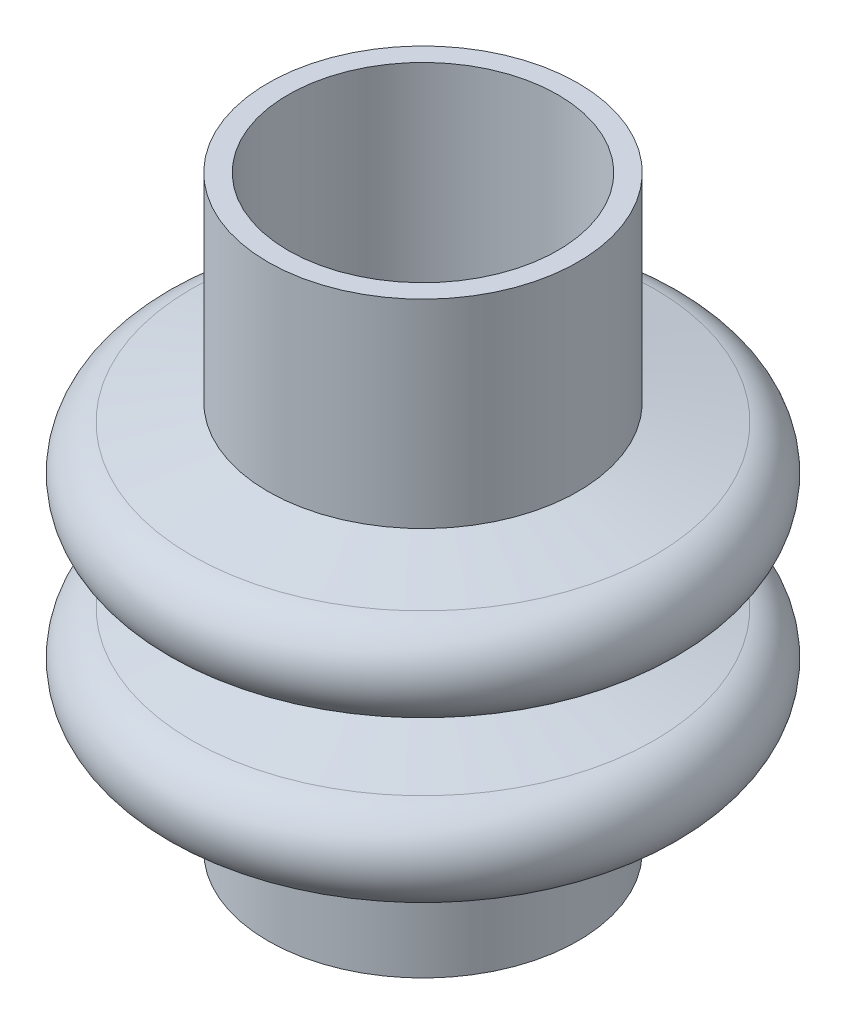
ISO-10303-21;
HEADER;
FILE_DESCRIPTION(('STEP AP214'),'2;1');
FILE_NAME('part.step','',(''),(''),'','','');
FILE_SCHEMA(('AUTOMOTIVE_DESIGN { 1 0 10303 214 1 1 1 1 }'));
ENDSEC;
DATA;
#1=APPLICATION_CONTEXT('core data for automotive mechanical design processes');
#2=APPLICATION_PROTOCOL_DEFINITION('international standard','automotive_design',2000,#1);
#3=PRODUCT_CONTEXT('',#1,'mechanical');
#4=PRODUCT('Part','Part','',(#3));
#5=PRODUCT_RELATED_PRODUCT_CATEGORY('part','',(#4));
#6=PRODUCT_DEFINITION_FORMATION('','',#4);
#7=PRODUCT_DEFINITION_CONTEXT('part definition',#1,'design');
#8=PRODUCT_DEFINITION('design','',#6,#7);
#9=PRODUCT_DEFINITION_SHAPE('','',#8);
#10=(LENGTH_UNIT() NAMED_UNIT(*) SI_UNIT(.MILLI.,.METRE.));
#11=(NAMED_UNIT(*) PLANE_ANGLE_UNIT() SI_UNIT($,.RADIAN.));
#12=(NAMED_UNIT(*) SI_UNIT($,.STERADIAN.) SOLID_ANGLE_UNIT());
#13=UNCERTAINTY_MEASURE_WITH_UNIT(LENGTH_MEASURE(1.E-05),#10,'distance_accuracy_value','');
#14=(GEOMETRIC_REPRESENTATION_CONTEXT(3) GLOBAL_UNCERTAINTY_ASSIGNED_CONTEXT((#13)) GLOBAL_UNIT_ASSIGNED_CONTEXT((#10,
#11,#12)) REPRESENTATION_CONTEXT('',''));
#15=CARTESIAN_POINT('',(0.,0.,0.));
#16=DIRECTION('',(0.,0.,1.));
#17=DIRECTION('',(1.,0.,0.));
#18=AXIS2_PLACEMENT_3D('',#15,#16,#17);
#19=CARTESIAN_POINT('',(-5.35570430156325,-15.3384460628714,0.));
#20=DIRECTION('',(0.,1.,0.));
#21=DIRECTION('',(0.,0.,1.));
#22=AXIS2_PLACEMENT_3D('',#19,#20,#21);
#23=PLANE('',#22);
#24=CARTESIAN_POINT('',(-5.35570430156325,-15.3384460628714,0.));
#25=DIRECTION('',(0.,-1.,0.));
#26=DIRECTION('',(0.,0.,-1.));
#27=AXIS2_PLACEMENT_3D('',#24,#25,#26);
#28=CIRCLE('',#27,5.35570430156325);
#29=CARTESIAN_POINT('',(-5.35570430156325,-15.3384460628714,-5.35570430156325));
#30=VERTEX_POINT('',#29);
#31=EDGE_CURVE('E78',#30,#30,#28,.T.);
#32=ORIENTED_EDGE('',*,*,#31,.F.);
#33=EDGE_LOOP('',(#32));
#34=FACE_BOUND('',#33,.T.);
#35=CARTESIAN_POINT('',(-5.35570430156325,-15.3384460628714,0.));
#36=DIRECTION('',(0.,-1.,0.));
#37=DIRECTION('',(0.,0.,-1.));
#38=AXIS2_PLACEMENT_3D('',#35,#36,#37);
#39=CIRCLE('',#38,6.15570430156325);
#40=CARTESIAN_POINT('',(-5.35570430156325,-15.3384460628714,-6.15570430156325));
#41=VERTEX_POINT('',#40);
#42=EDGE_CURVE('E36',#41,#41,#39,.T.);
#43=ORIENTED_EDGE('',*,*,#42,.T.);
#44=EDGE_LOOP('',(#43));
#45=FACE_BOUND('',#44,.T.);
#46=ADVANCED_FACE('F33',(#34,#45),#23,.F.);
#47=CARTESIAN_POINT('',(-5.35570430156325,8.,0.));
#48=DIRECTION('',(0.,1.,0.));
#49=DIRECTION('',(0.,0.,1.));
#50=AXIS2_PLACEMENT_3D('',#47,#48,#49);
#51=PLANE('',#50);
#52=CARTESIAN_POINT('',(-5.35570430156325,8.,0.));
#53=DIRECTION('',(0.,-1.,0.));
#54=DIRECTION('',(0.,0.,-1.));
#55=AXIS2_PLACEMENT_3D('',#52,#53,#54);
#56=CIRCLE('',#55,5.35570430156325);
#57=CARTESIAN_POINT('',(-5.35570430156325,8.,-5.35570430156325));
#58=VERTEX_POINT('',#57);
#59=EDGE_CURVE('E10',#58,#58,#56,.T.);
#60=ORIENTED_EDGE('',*,*,#59,.T.);
#61=EDGE_LOOP('',(#60));
#62=FACE_BOUND('',#61,.T.);
#63=CARTESIAN_POINT('',(-5.35570430156325,8.,0.));
#64=DIRECTION('',(0.,-1.,0.));
#65=DIRECTION('',(0.,0.,-1.));
#66=AXIS2_PLACEMENT_3D('',#63,#64,#65);
#67=CIRCLE('',#66,6.15570430156325);
#68=CARTESIAN_POINT('',(-5.35570430156325,8.,-6.15570430156325));
#69=VERTEX_POINT('',#68);
#70=EDGE_CURVE('E52',#69,#69,#67,.T.);
#71=ORIENTED_EDGE('',*,*,#70,.F.);
#72=EDGE_LOOP('',(#71));
#73=FACE_BOUND('',#72,.T.);
#74=ADVANCED_FACE('F120',(#62,#73),#51,.T.);
#75=CARTESIAN_POINT('',(-5.35570430156325,7.62110089921521,0.));
#76=DIRECTION('',(0.,-1.,0.));
#77=DIRECTION('',(0.,0.,-1.));
#78=AXIS2_PLACEMENT_3D('',#75,#76,#77);
#79=CYLINDRICAL_SURFACE('',#78,5.35570430156325);
#80=CARTESIAN_POINT('',(-5.35570430156325,-0.52453923827563,0.));
#81=DIRECTION('',(0.,-1.,0.));
#82=DIRECTION('',(0.,0.,-1.));
#83=AXIS2_PLACEMENT_3D('',#80,#81,#82);
#84=CIRCLE('',#83,5.35570430156325);
#85=CARTESIAN_POINT('',(-5.35570430156325,-0.52453923827563,-5.35570430156325));
#86=VERTEX_POINT('',#85);
#87=EDGE_CURVE('E40',#86,#86,#84,.T.);
#88=ORIENTED_EDGE('',*,*,#87,.T.);
#89=EDGE_LOOP('',(#88));
#90=FACE_BOUND('',#89,.T.);
#91=ORIENTED_EDGE('',*,*,#59,.F.);
#92=EDGE_LOOP('',(#91));
#93=FACE_BOUND('',#92,.T.);
#94=ADVANCED_FACE('F117',(#90,#93),#79,.F.);
#95=CARTESIAN_POINT('',(-5.35570430156325,-0.52453923827563,0.));
#96=DIRECTION('',(0.,-1.,0.));
#97=DIRECTION('',(0.,0.,-1.));
#98=AXIS2_PLACEMENT_3D('',#95,#96,#97);
#99=CONICAL_SURFACE('',#98,5.35570430156325,1.3456171774292);
#100=CARTESIAN_POINT('',(-5.35570430156325,-1.35926814614356,0.));
#101=DIRECTION('',(0.,-1.,0.));
#102=DIRECTION('',(0.,0.,-1.));
#103=AXIS2_PLACEMENT_3D('',#100,#101,#102);
#104=CIRCLE('',#103,8.9997916704913);
#105=CARTESIAN_POINT('',(-5.35570430156325,-1.35926814614356,-8.9997916704913));
#106=VERTEX_POINT('',#105);
#107=EDGE_CURVE('E45',#106,#106,#104,.T.);
#108=ORIENTED_EDGE('',*,*,#107,.T.);
#109=EDGE_LOOP('',(#108));
#110=FACE_BOUND('',#109,.T.);
#111=ORIENTED_EDGE('',*,*,#87,.F.);
#112=EDGE_LOOP('',(#111));
#113=FACE_BOUND('',#112,.T.);
#114=ADVANCED_FACE('F102',(#110,#113),#99,.F.);
#115=CARTESIAN_POINT('',(-5.35570430156325,-2.33402226820671,0.));
#116=DIRECTION('',(0.,-1.,0.));
#117=DIRECTION('',(0.,0.,-1.));
#118=AXIS2_PLACEMENT_3D('',#115,#116,#117);
#119=TOROIDAL_SURFACE('',#118,8.77651067819482,0.999999999999999);
#120=CARTESIAN_POINT('',(-5.35570430156325,-3.2938725379583,0.));
#121=DIRECTION('',(0.,-1.,0.));
#122=DIRECTION('',(0.,0.,-1.));
#123=AXIS2_PLACEMENT_3D('',#120,#121,#122);
#124=CIRCLE('',#123,9.05702352934035);
#125=CARTESIAN_POINT('',(-5.35570430156325,-3.2938725379583,-9.05702352934035));
#126=VERTEX_POINT('',#125);
#127=EDGE_CURVE('E97',#126,#126,#124,.T.);
#128=ORIENTED_EDGE('',*,*,#127,.T.);
#129=EDGE_LOOP('',(#128));
#130=FACE_BOUND('',#129,.T.);
#131=ORIENTED_EDGE('',*,*,#107,.F.);
#132=EDGE_LOOP('',(#131));
#133=FACE_BOUND('',#132,.T.);
#134=ADVANCED_FACE('F105',(#130,#133),#119,.F.);
#135=CARTESIAN_POINT('',(-5.35570430156325,-3.2938725379583,0.));
#136=DIRECTION('',(0.,1.,0.));
#137=DIRECTION('',(0.,0.,1.));
#138=AXIS2_PLACEMENT_3D('',#135,#136,#137);
#139=CONICAL_SURFACE('',#138,9.05702352934035,1.28646795599183);
#140=CARTESIAN_POINT('',(-5.35570430156325,-4.37557000922374,0.));
#141=DIRECTION('',(0.,-1.,0.));
#142=DIRECTION('',(0.,0.,-1.));
#143=AXIS2_PLACEMENT_3D('',#140,#141,#142);
#144=CIRCLE('',#143,5.35570430156325);
#145=CARTESIAN_POINT('',(-5.35570430156325,-4.37557000922374,-5.35570430156325));
#146=VERTEX_POINT('',#145);
#147=EDGE_CURVE('E94',#146,#146,#144,.T.);
#148=ORIENTED_EDGE('',*,*,#147,.T.);
#149=EDGE_LOOP('',(#148));
#150=FACE_BOUND('',#149,.T.);
#151=ORIENTED_EDGE('',*,*,#127,.F.);
#152=EDGE_LOOP('',(#151));
#153=FACE_BOUND('',#152,.T.);
#154=ADVANCED_FACE('F107',(#150,#153),#139,.F.);
#155=CARTESIAN_POINT('',(-5.35570430156325,7.62110089921521,0.));
#156=DIRECTION('',(0.,-1.,0.));
#157=DIRECTION('',(0.,0.,-1.));
#158=AXIS2_PLACEMENT_3D('',#155,#156,#157);
#159=CYLINDRICAL_SURFACE('',#158,5.35570430156325);
#160=CARTESIAN_POINT('',(-5.35570430156325,-6.87994296358138,0.));
#161=DIRECTION('',(0.,-1.,0.));
#162=DIRECTION('',(0.,0.,-1.));
#163=AXIS2_PLACEMENT_3D('',#160,#161,#162);
#164=CIRCLE('',#163,5.35570430156325);
#165=CARTESIAN_POINT('',(-5.35570430156325,-6.87994296358138,-5.35570430156325));
#166=VERTEX_POINT('',#165);
#167=EDGE_CURVE('E91',#166,#166,#164,.T.);
#168=ORIENTED_EDGE('',*,*,#167,.T.);
#169=EDGE_LOOP('',(#168));
#170=FACE_BOUND('',#169,.T.);
#171=ORIENTED_EDGE('',*,*,#147,.F.);
#172=EDGE_LOOP('',(#171));
#173=FACE_BOUND('',#172,.T.);
#174=ADVANCED_FACE('F114',(#170,#173),#159,.F.);
#175=CARTESIAN_POINT('',(-5.35570430156325,-6.87994296358138,0.));
#176=DIRECTION('',(0.,-1.,0.));
#177=DIRECTION('',(0.,0.,-1.));
#178=AXIS2_PLACEMENT_3D('',#175,#176,#177);
#179=CONICAL_SURFACE('',#178,5.35570430156325,1.3456171774292);
#180=CARTESIAN_POINT('',(-5.35570430156325,-7.71467187144931,0.));
#181=DIRECTION('',(0.,-1.,0.));
#182=DIRECTION('',(0.,0.,-1.));
#183=AXIS2_PLACEMENT_3D('',#180,#181,#182);
#184=CIRCLE('',#183,8.9997916704913);
#185=CARTESIAN_POINT('',(-5.35570430156325,-7.71467187144931,-8.9997916704913));
#186=VERTEX_POINT('',#185);
#187=EDGE_CURVE('E88',#186,#186,#184,.T.);
#188=ORIENTED_EDGE('',*,*,#187,.T.);
#189=EDGE_LOOP('',(#188));
#190=FACE_BOUND('',#189,.T.);
#191=ORIENTED_EDGE('',*,*,#167,.F.);
#192=EDGE_LOOP('',(#191));
#193=FACE_BOUND('',#192,.T.);
#194=ADVANCED_FACE('F223',(#190,#193),#179,.F.);
#195=CARTESIAN_POINT('',(-5.35570430156325,-8.68942599351245,0.));
#196=DIRECTION('',(0.,-1.,0.));
#197=DIRECTION('',(0.,0.,-1.));
#198=AXIS2_PLACEMENT_3D('',#195,#196,#197);
#199=TOROIDAL_SURFACE('',#198,8.77651067819482,0.999999999999999);
#200=CARTESIAN_POINT('',(-5.35570430156325,-9.64927626326404,0.));
#201=DIRECTION('',(0.,-1.,0.));
#202=DIRECTION('',(0.,0.,-1.));
#203=AXIS2_PLACEMENT_3D('',#200,#201,#202);
#204=CIRCLE('',#203,9.05702352934035);
#205=CARTESIAN_POINT('',(-5.35570430156325,-9.64927626326404,-9.05702352934035));
#206=VERTEX_POINT('',#205);
#207=EDGE_CURVE('E83',#206,#206,#204,.T.);
#208=ORIENTED_EDGE('',*,*,#207,.T.);
#209=EDGE_LOOP('',(#208));
#210=FACE_BOUND('',#209,.T.);
#211=ORIENTED_EDGE('',*,*,#187,.F.);
#212=EDGE_LOOP('',(#211));
#213=FACE_BOUND('',#212,.T.);
#214=ADVANCED_FACE('F233',(#210,#213),#199,.F.);
#215=CARTESIAN_POINT('',(-5.35570430156325,-9.64927626326404,0.));
#216=DIRECTION('',(0.,1.,0.));
#217=DIRECTION('',(0.,0.,1.));
#218=AXIS2_PLACEMENT_3D('',#215,#216,#217);
#219=CONICAL_SURFACE('',#218,9.05702352934035,1.28646795599183);
#220=CARTESIAN_POINT('',(-5.35570430156325,-10.7309737345295,0.));
#221=DIRECTION('',(0.,-1.,0.));
#222=DIRECTION('',(0.,0.,-1.));
#223=AXIS2_PLACEMENT_3D('',#220,#221,#222);
#224=CIRCLE('',#223,5.35570430156325);
#225=CARTESIAN_POINT('',(-5.35570430156325,-10.7309737345295,-5.35570430156325));
#226=VERTEX_POINT('',#225);
#227=EDGE_CURVE('E74',#226,#226,#224,.T.);
#228=ORIENTED_EDGE('',*,*,#227,.T.);
#229=EDGE_LOOP('',(#228));
#230=FACE_BOUND('',#229,.T.);
#231=ORIENTED_EDGE('',*,*,#207,.F.);
#232=EDGE_LOOP('',(#231));
#233=FACE_BOUND('',#232,.T.);
#234=ADVANCED_FACE('F185',(#230,#233),#219,.F.);
#235=CARTESIAN_POINT('',(-5.35570430156325,7.62110089921521,0.));
#236=DIRECTION('',(0.,-1.,0.));
#237=DIRECTION('',(0.,0.,-1.));
#238=AXIS2_PLACEMENT_3D('',#235,#236,#237);
#239=CYLINDRICAL_SURFACE('',#238,5.35570430156325);
#240=ORIENTED_EDGE('',*,*,#31,.T.);
#241=EDGE_LOOP('',(#240));
#242=FACE_BOUND('',#241,.T.);
#243=ORIENTED_EDGE('',*,*,#227,.F.);
#244=EDGE_LOOP('',(#243));
#245=FACE_BOUND('',#244,.T.);
#246=ADVANCED_FACE('F180',(#242,#245),#239,.F.);
#247=CARTESIAN_POINT('',(-5.35570430156325,7.62110089921521,0.));
#248=DIRECTION('',(0.,-1.,0.));
#249=DIRECTION('',(0.,0.,-1.));
#250=AXIS2_PLACEMENT_3D('',#247,#248,#249);
#251=CYLINDRICAL_SURFACE('',#250,6.15570430156325);
#252=CARTESIAN_POINT('',(-5.35570430156325,0.112929423921548,0.));
#253=DIRECTION('',(0.,-1.,0.));
#254=DIRECTION('',(0.,0.,-1.));
#255=AXIS2_PLACEMENT_3D('',#252,#253,#254);
#256=CIRCLE('',#255,6.15570430156325);
#257=CARTESIAN_POINT('',(-5.35570430156325,0.112929423921548,-6.15570430156325));
#258=VERTEX_POINT('',#257);
#259=EDGE_CURVE('E49',#258,#258,#256,.T.);
#260=ORIENTED_EDGE('',*,*,#259,.F.);
#261=EDGE_LOOP('',(#260));
#262=FACE_BOUND('',#261,.T.);
#263=ORIENTED_EDGE('',*,*,#70,.T.);
#264=EDGE_LOOP('',(#263));
#265=FACE_BOUND('',#264,.T.);
#266=ADVANCED_FACE('F175',(#262,#265),#251,.T.);
#267=CARTESIAN_POINT('',(-5.35570430156325,0.255264059374878,0.));
#268=DIRECTION('',(0.,-1.,0.));
#269=DIRECTION('',(0.,0.,-1.));
#270=AXIS2_PLACEMENT_3D('',#267,#268,#269);
#271=CONICAL_SURFACE('',#270,5.53432909540048,1.3456171774292);
#272=CARTESIAN_POINT('',(-5.35570430156325,-0.579464848493052,0.));
#273=DIRECTION('',(0.,-1.,0.));
#274=DIRECTION('',(0.,0.,-1.));
#275=AXIS2_PLACEMENT_3D('',#272,#273,#274);
#276=CIRCLE('',#275,9.17841646432852);
#277=CARTESIAN_POINT('',(-5.35570430156325,-0.579464848493052,-9.17841646432852));
#278=VERTEX_POINT('',#277);
#279=EDGE_CURVE('E53',#278,#278,#276,.T.);
#280=ORIENTED_EDGE('',*,*,#279,.F.);
#281=EDGE_LOOP('',(#280));
#282=FACE_BOUND('',#281,.T.);
#283=ORIENTED_EDGE('',*,*,#259,.T.);
#284=EDGE_LOOP('',(#283));
#285=FACE_BOUND('',#284,.T.);
#286=ADVANCED_FACE('F169',(#282,#285),#271,.T.);
#287=CARTESIAN_POINT('',(-5.35570430156325,-2.33402226820671,0.));
#288=DIRECTION('',(0.,-1.,0.));
#289=DIRECTION('',(0.,0.,-1.));
#290=AXIS2_PLACEMENT_3D('',#287,#288,#289);
#291=TOROIDAL_SURFACE('',#290,8.77651067819482,1.8);
#292=CARTESIAN_POINT('',(-5.35570430156325,-4.06175275375957,0.));
#293=DIRECTION('',(0.,-1.,0.));
#294=DIRECTION('',(0.,0.,-1.));
#295=AXIS2_PLACEMENT_3D('',#292,#293,#294);
#296=CIRCLE('',#295,9.28143381025678);
#297=CARTESIAN_POINT('',(-5.35570430156325,-4.06175275375957,-9.28143381025678));
#298=VERTEX_POINT('',#297);
#299=EDGE_CURVE('E56',#298,#298,#296,.T.);
#300=ORIENTED_EDGE('',*,*,#299,.F.);
#301=EDGE_LOOP('',(#300));
#302=FACE_BOUND('',#301,.T.);
#303=ORIENTED_EDGE('',*,*,#279,.T.);
#304=EDGE_LOOP('',(#303));
#305=FACE_BOUND('',#304,.T.);
#306=ADVANCED_FACE('F163',(#302,#305),#291,.T.);
#307=CARTESIAN_POINT('',(-5.35570430156325,-4.06175275375956,0.));
#308=DIRECTION('',(0.,1.,0.));
#309=DIRECTION('',(0.,0.,1.));
#310=AXIS2_PLACEMENT_3D('',#307,#308,#309);
#311=CONICAL_SURFACE('',#310,9.28143381025682,1.28646795599183);
#312=CARTESIAN_POINT('',(-5.35570430156325,-4.97523616260462,0.));
#313=DIRECTION('',(0.,1.,0.));
#314=DIRECTION('',(0.,0.,1.));
#315=AXIS2_PLACEMENT_3D('',#312,#313,#314);
#316=CIRCLE('',#315,6.15570430156325);
#317=CARTESIAN_POINT('',(-5.35570430156325,-4.97523616260462,6.15570430156325));
#318=VERTEX_POINT('',#317);
#319=EDGE_CURVE('E59',#318,#318,#316,.F.);
#320=ORIENTED_EDGE('',*,*,#319,.F.);
#321=EDGE_LOOP('',(#320));
#322=FACE_BOUND('',#321,.T.);
#323=ORIENTED_EDGE('',*,*,#299,.T.);
#324=EDGE_LOOP('',(#323));
#325=FACE_BOUND('',#324,.T.);
#326=ADVANCED_FACE('F157',(#322,#325),#311,.T.);
#327=CARTESIAN_POINT('',(-5.35570430156325,7.62110089921521,0.));
#328=DIRECTION('',(0.,-1.,0.));
#329=DIRECTION('',(0.,0.,-1.));
#330=AXIS2_PLACEMENT_3D('',#327,#328,#329);
#331=CYLINDRICAL_SURFACE('',#330,6.15570430156325);
#332=CARTESIAN_POINT('',(-5.35570430156325,-6.2424743013842,0.));
#333=DIRECTION('',(0.,-1.,0.));
#334=DIRECTION('',(0.,0.,-1.));
#335=AXIS2_PLACEMENT_3D('',#332,#333,#334);
#336=CIRCLE('',#335,6.15570430156325);
#337=CARTESIAN_POINT('',(-5.35570430156325,-6.2424743013842,-6.15570430156325));
#338=VERTEX_POINT('',#337);
#339=EDGE_CURVE('E62',#338,#338,#336,.T.);
#340=ORIENTED_EDGE('',*,*,#339,.F.);
#341=EDGE_LOOP('',(#340));
#342=FACE_BOUND('',#341,.T.);
#343=ORIENTED_EDGE('',*,*,#319,.T.);
#344=EDGE_LOOP('',(#343));
#345=FACE_BOUND('',#344,.T.);
#346=ADVANCED_FACE('F151',(#342,#345),#331,.T.);
#347=CARTESIAN_POINT('',(-5.35570430156325,-6.10013966593087,0.));
#348=DIRECTION('',(0.,-1.,0.));
#349=DIRECTION('',(0.,0.,-1.));
#350=AXIS2_PLACEMENT_3D('',#347,#348,#349);
#351=CONICAL_SURFACE('',#350,5.53432909540048,1.3456171774292);
#352=CARTESIAN_POINT('',(-5.35570430156325,-6.9348685737988,0.));
#353=DIRECTION('',(0.,-1.,0.));
#354=DIRECTION('',(0.,0.,-1.));
#355=AXIS2_PLACEMENT_3D('',#352,#353,#354);
#356=CIRCLE('',#355,9.17841646432852);
#357=CARTESIAN_POINT('',(-5.35570430156325,-6.9348685737988,-9.17841646432852));
#358=VERTEX_POINT('',#357);
#359=EDGE_CURVE('E65',#358,#358,#356,.T.);
#360=ORIENTED_EDGE('',*,*,#359,.F.);
#361=EDGE_LOOP('',(#360));
#362=FACE_BOUND('',#361,.T.);
#363=ORIENTED_EDGE('',*,*,#339,.T.);
#364=EDGE_LOOP('',(#363));
#365=FACE_BOUND('',#364,.T.);
#366=ADVANCED_FACE('F145',(#362,#365),#351,.T.);
#367=CARTESIAN_POINT('',(-5.35570430156325,-8.68942599351245,0.));
#368=DIRECTION('',(0.,-1.,0.));
#369=DIRECTION('',(0.,0.,-1.));
#370=AXIS2_PLACEMENT_3D('',#367,#368,#369);
#371=TOROIDAL_SURFACE('',#370,8.77651067819482,1.8);
#372=CARTESIAN_POINT('',(-5.35570430156325,-10.4171564790653,0.));
#373=DIRECTION('',(0.,-1.,0.));
#374=DIRECTION('',(0.,0.,-1.));
#375=AXIS2_PLACEMENT_3D('',#372,#373,#374);
#376=CIRCLE('',#375,9.28143381025678);
#377=CARTESIAN_POINT('',(-5.35570430156325,-10.4171564790653,-9.28143381025678));
#378=VERTEX_POINT('',#377);
#379=EDGE_CURVE('E68',#378,#378,#376,.T.);
#380=ORIENTED_EDGE('',*,*,#379,.F.);
#381=EDGE_LOOP('',(#380));
#382=FACE_BOUND('',#381,.T.);
#383=ORIENTED_EDGE('',*,*,#359,.T.);
#384=EDGE_LOOP('',(#383));
#385=FACE_BOUND('',#384,.T.);
#386=ADVANCED_FACE('F139',(#382,#385),#371,.T.);
#387=CARTESIAN_POINT('',(-5.35570430156325,-10.4171564790653,0.));
#388=DIRECTION('',(0.,1.,0.));
#389=DIRECTION('',(0.,0.,1.));
#390=AXIS2_PLACEMENT_3D('',#387,#388,#389);
#391=CONICAL_SURFACE('',#390,9.28143381025682,1.28646795599183);
#392=CARTESIAN_POINT('',(-5.35570430156325,-11.3306398879104,0.));
#393=DIRECTION('',(0.,1.,0.));
#394=DIRECTION('',(0.,0.,1.));
#395=AXIS2_PLACEMENT_3D('',#392,#393,#394);
#396=CIRCLE('',#395,6.15570430156325);
#397=CARTESIAN_POINT('',(-5.35570430156325,-11.3306398879104,6.15570430156325));
#398=VERTEX_POINT('',#397);
#399=EDGE_CURVE('E71',#398,#398,#396,.F.);
#400=ORIENTED_EDGE('',*,*,#399,.F.);
#401=EDGE_LOOP('',(#400));
#402=FACE_BOUND('',#401,.T.);
#403=ORIENTED_EDGE('',*,*,#379,.T.);
#404=EDGE_LOOP('',(#403));
#405=FACE_BOUND('',#404,.T.);
#406=ADVANCED_FACE('F133',(#402,#405),#391,.T.);
#407=CARTESIAN_POINT('',(-5.35570430156325,7.62110089921521,0.));
#408=DIRECTION('',(0.,-1.,0.));
#409=DIRECTION('',(0.,0.,-1.));
#410=AXIS2_PLACEMENT_3D('',#407,#408,#409);
#411=CYLINDRICAL_SURFACE('',#410,6.15570430156325);
#412=ORIENTED_EDGE('',*,*,#42,.F.);
#413=EDGE_LOOP('',(#412));
#414=FACE_BOUND('',#413,.T.);
#415=ORIENTED_EDGE('',*,*,#399,.T.);
#416=EDGE_LOOP('',(#415));
#417=FACE_BOUND('',#416,.T.);
#418=ADVANCED_FACE('F130',(#414,#417),#411,.T.);
#419=CLOSED_SHELL('',(#46,#74,#94,#114,#134,#154,#174,#194,#214,#234,#246,#266,#286,#306,#326,
#346,#366,#386,#406,#418));
#420=MANIFOLD_SOLID_BREP('B2',#419);
#421=ADVANCED_BREP_SHAPE_REPRESENTATION('',(#18,#420),#14);
#422=SHAPE_DEFINITION_REPRESENTATION(#9,#421);
ENDSEC;
END-ISO-10303-21;
